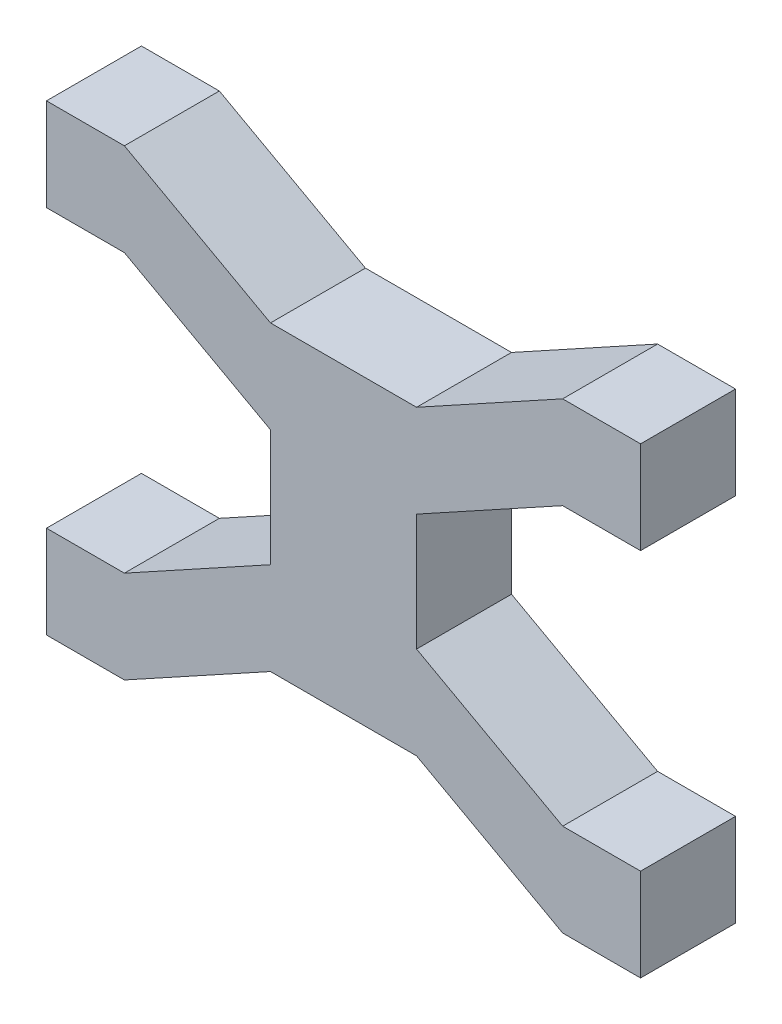
ISO-10303-21;
HEADER;
FILE_DESCRIPTION(('STEP AP214'),'2;1');
FILE_NAME('part.step','',(''),(''),'','','');
FILE_SCHEMA(('AUTOMOTIVE_DESIGN { 1 0 10303 214 1 1 1 1 }'));
ENDSEC;
DATA;
#1=APPLICATION_CONTEXT('core data for automotive mechanical design processes');
#2=APPLICATION_PROTOCOL_DEFINITION('international standard','automotive_design',2000,#1);
#3=PRODUCT_CONTEXT('',#1,'mechanical');
#4=PRODUCT('Part','Part','',(#3));
#5=PRODUCT_RELATED_PRODUCT_CATEGORY('part','',(#4));
#6=PRODUCT_DEFINITION_FORMATION('','',#4);
#7=PRODUCT_DEFINITION_CONTEXT('part definition',#1,'design');
#8=PRODUCT_DEFINITION('design','',#6,#7);
#9=PRODUCT_DEFINITION_SHAPE('','',#8);
#10=(LENGTH_UNIT() NAMED_UNIT(*) SI_UNIT(.MILLI.,.METRE.));
#11=(NAMED_UNIT(*) PLANE_ANGLE_UNIT() SI_UNIT($,.RADIAN.));
#12=(NAMED_UNIT(*) SI_UNIT($,.STERADIAN.) SOLID_ANGLE_UNIT());
#13=UNCERTAINTY_MEASURE_WITH_UNIT(LENGTH_MEASURE(1.E-05),#10,'distance_accuracy_value','');
#14=(GEOMETRIC_REPRESENTATION_CONTEXT(3) GLOBAL_UNCERTAINTY_ASSIGNED_CONTEXT((#13)) GLOBAL_UNIT_ASSIGNED_CONTEXT((#10,
#11,#12)) REPRESENTATION_CONTEXT('',''));
#15=CARTESIAN_POINT('',(0.,0.,0.));
#16=DIRECTION('',(0.,0.,1.));
#17=DIRECTION('',(1.,0.,0.));
#18=AXIS2_PLACEMENT_3D('',#15,#16,#17);
#19=CARTESIAN_POINT('',(-30.5,0.,9.75));
#20=DIRECTION('',(-1.,0.,0.));
#21=DIRECTION('',(0.,0.,1.));
#22=AXIS2_PLACEMENT_3D('',#19,#20,#21);
#23=PLANE('',#22);
#24=DIRECTION('',(0.,1.,0.));
#25=VECTOR('',#24,1.);
#26=CARTESIAN_POINT('',(-30.5,0.,0.));
#27=LINE('',#26,#25);
#28=CARTESIAN_POINT('',(-30.5,14.25,0.));
#29=VERTEX_POINT('',#28);
#30=CARTESIAN_POINT('',(-30.5,23.75,0.));
#31=VERTEX_POINT('',#30);
#32=EDGE_CURVE('E226',#29,#31,#27,.T.);
#33=ORIENTED_EDGE('',*,*,#32,.F.);
#34=DIRECTION('',(0.,0.,-1.));
#35=VECTOR('',#34,1.);
#36=CARTESIAN_POINT('',(-30.5,14.25,9.75));
#37=LINE('',#36,#35);
#38=CARTESIAN_POINT('',(-30.5,14.25,9.75));
#39=VERTEX_POINT('',#38);
#40=EDGE_CURVE('E11',#39,#29,#37,.T.);
#41=ORIENTED_EDGE('',*,*,#40,.F.);
#42=DIRECTION('',(0.,1.,0.));
#43=VECTOR('',#42,1.);
#44=CARTESIAN_POINT('',(-30.5,0.,9.75));
#45=LINE('',#44,#43);
#46=CARTESIAN_POINT('',(-30.5,23.75,9.75));
#47=VERTEX_POINT('',#46);
#48=EDGE_CURVE('E286',#39,#47,#45,.T.);
#49=ORIENTED_EDGE('',*,*,#48,.T.);
#50=DIRECTION('',(0.,0.,-1.));
#51=VECTOR('',#50,1.);
#52=CARTESIAN_POINT('',(-30.5,23.75,9.75));
#53=LINE('',#52,#51);
#54=EDGE_CURVE('E52',#47,#31,#53,.T.);
#55=ORIENTED_EDGE('',*,*,#54,.T.);
#56=EDGE_LOOP('',(#33,#41,#49,#55));
#57=FACE_BOUND('',#56,.T.);
#58=ADVANCED_FACE('F36',(#57),#23,.T.);
#59=CARTESIAN_POINT('',(0.,14.25,9.75));
#60=DIRECTION('',(0.,1.,0.));
#61=DIRECTION('',(-1.,0.,0.));
#62=AXIS2_PLACEMENT_3D('',#59,#60,#61);
#63=PLANE('',#62);
#64=DIRECTION('',(1.,0.,0.));
#65=VECTOR('',#64,1.);
#66=CARTESIAN_POINT('',(0.,14.25,0.));
#67=LINE('',#66,#65);
#68=CARTESIAN_POINT('',(-22.5,14.25,0.));
#69=VERTEX_POINT('',#68);
#70=EDGE_CURVE('E228',#29,#69,#67,.T.);
#71=ORIENTED_EDGE('',*,*,#70,.T.);
#72=DIRECTION('',(0.,0.,-1.));
#73=VECTOR('',#72,1.);
#74=CARTESIAN_POINT('',(-22.5,14.25,9.75));
#75=LINE('',#74,#73);
#76=CARTESIAN_POINT('',(-22.5,14.25,9.75));
#77=VERTEX_POINT('',#76);
#78=EDGE_CURVE('E44',#77,#69,#75,.T.);
#79=ORIENTED_EDGE('',*,*,#78,.F.);
#80=DIRECTION('',(1.,0.,0.));
#81=VECTOR('',#80,1.);
#82=CARTESIAN_POINT('',(0.,14.25,9.75));
#83=LINE('',#82,#81);
#84=EDGE_CURVE('E356',#39,#77,#83,.T.);
#85=ORIENTED_EDGE('',*,*,#84,.F.);
#86=ORIENTED_EDGE('',*,*,#40,.T.);
#87=EDGE_LOOP('',(#71,#79,#85,#86));
#88=FACE_BOUND('',#87,.T.);
#89=ADVANCED_FACE('F417',(#88),#63,.F.);
#90=CARTESIAN_POINT('',(0.791746641074856,1.43953934740883,9.75));
#91=DIRECTION('',(0.481918749772156,0.876215908676647,0.));
#92=DIRECTION('',(-0.876215908676647,0.481918749772156,0.));
#93=AXIS2_PLACEMENT_3D('',#90,#91,#92);
#94=PLANE('',#93);
#95=DIRECTION('',(0.876215908676647,-0.481918749772156,0.));
#96=VECTOR('',#95,1.);
#97=CARTESIAN_POINT('',(0.791746641074856,1.43953934740883,0.));
#98=LINE('',#97,#96);
#99=CARTESIAN_POINT('',(-7.5,6.,0.));
#100=VERTEX_POINT('',#99);
#101=EDGE_CURVE('E230',#69,#100,#98,.T.);
#102=ORIENTED_EDGE('',*,*,#101,.T.);
#103=DIRECTION('',(0.,0.,-1.));
#104=VECTOR('',#103,1.);
#105=CARTESIAN_POINT('',(-7.5,6.,9.75));
#106=LINE('',#105,#104);
#107=CARTESIAN_POINT('',(-7.5,6.,9.75));
#108=VERTEX_POINT('',#107);
#109=EDGE_CURVE('E330',#108,#100,#106,.T.);
#110=ORIENTED_EDGE('',*,*,#109,.F.);
#111=DIRECTION('',(0.876215908676647,-0.481918749772156,0.));
#112=VECTOR('',#111,1.);
#113=CARTESIAN_POINT('',(0.791746641074856,1.43953934740883,9.75));
#114=LINE('',#113,#112);
#115=EDGE_CURVE('E338',#77,#108,#114,.T.);
#116=ORIENTED_EDGE('',*,*,#115,.F.);
#117=ORIENTED_EDGE('',*,*,#78,.T.);
#118=EDGE_LOOP('',(#102,#110,#116,#117));
#119=FACE_BOUND('',#118,.T.);
#120=ADVANCED_FACE('F336',(#119),#94,.F.);
#121=CARTESIAN_POINT('',(-7.5,0.,9.75));
#122=DIRECTION('',(-1.,0.,0.));
#123=DIRECTION('',(0.,0.,1.));
#124=AXIS2_PLACEMENT_3D('',#121,#122,#123);
#125=PLANE('',#124);
#126=DIRECTION('',(0.,1.,0.));
#127=VECTOR('',#126,1.);
#128=CARTESIAN_POINT('',(-7.5,0.,0.));
#129=LINE('',#128,#127);
#130=CARTESIAN_POINT('',(-7.5,-6.,0.));
#131=VERTEX_POINT('',#130);
#132=EDGE_CURVE('E233',#131,#100,#129,.T.);
#133=ORIENTED_EDGE('',*,*,#132,.F.);
#134=DIRECTION('',(0.,0.,-1.));
#135=VECTOR('',#134,1.);
#136=CARTESIAN_POINT('',(-7.5,-6.,9.75));
#137=LINE('',#136,#135);
#138=CARTESIAN_POINT('',(-7.5,-6.,9.75));
#139=VERTEX_POINT('',#138);
#140=EDGE_CURVE('E328',#139,#131,#137,.T.);
#141=ORIENTED_EDGE('',*,*,#140,.F.);
#142=DIRECTION('',(0.,1.,0.));
#143=VECTOR('',#142,1.);
#144=CARTESIAN_POINT('',(-7.5,0.,9.75));
#145=LINE('',#144,#143);
#146=EDGE_CURVE('E349',#139,#108,#145,.T.);
#147=ORIENTED_EDGE('',*,*,#146,.T.);
#148=ORIENTED_EDGE('',*,*,#109,.T.);
#149=EDGE_LOOP('',(#133,#141,#147,#148));
#150=FACE_BOUND('',#149,.T.);
#151=ADVANCED_FACE('F346',(#150),#125,.T.);
#152=CARTESIAN_POINT('',(0.791746641074856,-1.43953934740883,9.75));
#153=DIRECTION('',(-0.481918749772156,0.876215908676647,0.));
#154=DIRECTION('',(-0.876215908676647,-0.481918749772156,0.));
#155=AXIS2_PLACEMENT_3D('',#152,#153,#154);
#156=PLANE('',#155);
#157=DIRECTION('',(0.876215908676647,0.481918749772156,0.));
#158=VECTOR('',#157,1.);
#159=CARTESIAN_POINT('',(0.791746641074856,-1.43953934740883,0.));
#160=LINE('',#159,#158);
#161=CARTESIAN_POINT('',(-22.5,-14.25,0.));
#162=VERTEX_POINT('',#161);
#163=EDGE_CURVE('E236',#162,#131,#160,.T.);
#164=ORIENTED_EDGE('',*,*,#163,.F.);
#165=DIRECTION('',(0.,0.,-1.));
#166=VECTOR('',#165,1.);
#167=CARTESIAN_POINT('',(-22.5,-14.25,9.75));
#168=LINE('',#167,#166);
#169=CARTESIAN_POINT('',(-22.5,-14.25,9.75));
#170=VERTEX_POINT('',#169);
#171=EDGE_CURVE('E326',#170,#162,#168,.T.);
#172=ORIENTED_EDGE('',*,*,#171,.F.);
#173=DIRECTION('',(0.876215908676647,0.481918749772156,0.));
#174=VECTOR('',#173,1.);
#175=CARTESIAN_POINT('',(0.791746641074856,-1.43953934740883,9.75));
#176=LINE('',#175,#174);
#177=EDGE_CURVE('E352',#170,#139,#176,.T.);
#178=ORIENTED_EDGE('',*,*,#177,.T.);
#179=ORIENTED_EDGE('',*,*,#140,.T.);
#180=EDGE_LOOP('',(#164,#172,#178,#179));
#181=FACE_BOUND('',#180,.T.);
#182=ADVANCED_FACE('F428',(#181),#156,.T.);
#183=CARTESIAN_POINT('',(0.,-14.25,9.75));
#184=DIRECTION('',(0.,1.,0.));
#185=DIRECTION('',(-1.,0.,0.));
#186=AXIS2_PLACEMENT_3D('',#183,#184,#185);
#187=PLANE('',#186);
#188=DIRECTION('',(1.,0.,0.));
#189=VECTOR('',#188,1.);
#190=CARTESIAN_POINT('',(0.,-14.25,0.));
#191=LINE('',#190,#189);
#192=CARTESIAN_POINT('',(-30.5,-14.25,0.));
#193=VERTEX_POINT('',#192);
#194=EDGE_CURVE('E239',#193,#162,#191,.T.);
#195=ORIENTED_EDGE('',*,*,#194,.F.);
#196=DIRECTION('',(0.,0.,-1.));
#197=VECTOR('',#196,1.);
#198=CARTESIAN_POINT('',(-30.5,-14.25,9.75));
#199=LINE('',#198,#197);
#200=CARTESIAN_POINT('',(-30.5,-14.25,9.75));
#201=VERTEX_POINT('',#200);
#202=EDGE_CURVE('E324',#201,#193,#199,.T.);
#203=ORIENTED_EDGE('',*,*,#202,.F.);
#204=DIRECTION('',(1.,0.,0.));
#205=VECTOR('',#204,1.);
#206=CARTESIAN_POINT('',(0.,-14.25,9.75));
#207=LINE('',#206,#205);
#208=EDGE_CURVE('E354',#201,#170,#207,.T.);
#209=ORIENTED_EDGE('',*,*,#208,.T.);
#210=ORIENTED_EDGE('',*,*,#171,.T.);
#211=EDGE_LOOP('',(#195,#203,#209,#210));
#212=FACE_BOUND('',#211,.T.);
#213=ADVANCED_FACE('F431',(#212),#187,.T.);
#214=CARTESIAN_POINT('',(-30.5,0.,9.75));
#215=DIRECTION('',(1.,0.,0.));
#216=DIRECTION('',(0.,0.,-1.));
#217=AXIS2_PLACEMENT_3D('',#214,#215,#216);
#218=PLANE('',#217);
#219=DIRECTION('',(0.,-1.,0.));
#220=VECTOR('',#219,1.);
#221=CARTESIAN_POINT('',(-30.5,0.,0.));
#222=LINE('',#221,#220);
#223=CARTESIAN_POINT('',(-30.5,-23.75,0.));
#224=VERTEX_POINT('',#223);
#225=EDGE_CURVE('E242',#193,#224,#222,.T.);
#226=ORIENTED_EDGE('',*,*,#225,.T.);
#227=DIRECTION('',(0.,0.,-1.));
#228=VECTOR('',#227,1.);
#229=CARTESIAN_POINT('',(-30.5,-23.75,9.75));
#230=LINE('',#229,#228);
#231=CARTESIAN_POINT('',(-30.5,-23.75,9.75));
#232=VERTEX_POINT('',#231);
#233=EDGE_CURVE('E321',#232,#224,#230,.T.);
#234=ORIENTED_EDGE('',*,*,#233,.F.);
#235=DIRECTION('',(0.,-1.,0.));
#236=VECTOR('',#235,1.);
#237=CARTESIAN_POINT('',(-30.5,0.,9.75));
#238=LINE('',#237,#236);
#239=EDGE_CURVE('E362',#201,#232,#238,.T.);
#240=ORIENTED_EDGE('',*,*,#239,.F.);
#241=ORIENTED_EDGE('',*,*,#202,.T.);
#242=EDGE_LOOP('',(#226,#234,#240,#241));
#243=FACE_BOUND('',#242,.T.);
#244=ADVANCED_FACE('F435',(#243),#218,.F.);
#245=CARTESIAN_POINT('',(0.,-23.75,9.75));
#246=DIRECTION('',(0.,1.,0.));
#247=DIRECTION('',(-1.,0.,0.));
#248=AXIS2_PLACEMENT_3D('',#245,#246,#247);
#249=PLANE('',#248);
#250=DIRECTION('',(1.,0.,0.));
#251=VECTOR('',#250,1.);
#252=CARTESIAN_POINT('',(0.,-23.75,0.));
#253=LINE('',#252,#251);
#254=CARTESIAN_POINT('',(-22.5,-23.75,0.));
#255=VERTEX_POINT('',#254);
#256=EDGE_CURVE('E244',#224,#255,#253,.T.);
#257=ORIENTED_EDGE('',*,*,#256,.T.);
#258=DIRECTION('',(0.,0.,-1.));
#259=VECTOR('',#258,1.);
#260=CARTESIAN_POINT('',(-22.5,-23.75,9.75));
#261=LINE('',#260,#259);
#262=CARTESIAN_POINT('',(-22.5,-23.75,9.75));
#263=VERTEX_POINT('',#262);
#264=EDGE_CURVE('E318',#263,#255,#261,.T.);
#265=ORIENTED_EDGE('',*,*,#264,.F.);
#266=DIRECTION('',(1.,0.,0.));
#267=VECTOR('',#266,1.);
#268=CARTESIAN_POINT('',(0.,-23.75,9.75));
#269=LINE('',#268,#267);
#270=EDGE_CURVE('E364',#232,#263,#269,.T.);
#271=ORIENTED_EDGE('',*,*,#270,.F.);
#272=ORIENTED_EDGE('',*,*,#233,.T.);
#273=EDGE_LOOP('',(#257,#265,#271,#272));
#274=FACE_BOUND('',#273,.T.);
#275=ADVANCED_FACE('F439',(#274),#249,.F.);
#276=CARTESIAN_POINT('',(4.80326295585412,-8.73320537428022,9.75));
#277=DIRECTION('',(-0.481918749772156,0.876215908676647,0.));
#278=DIRECTION('',(-0.876215908676647,-0.481918749772156,0.));
#279=AXIS2_PLACEMENT_3D('',#276,#277,#278);
#280=PLANE('',#279);
#281=DIRECTION('',(0.876215908676647,0.481918749772156,0.));
#282=VECTOR('',#281,1.);
#283=CARTESIAN_POINT('',(4.80326295585412,-8.73320537428022,0.));
#284=LINE('',#283,#282);
#285=CARTESIAN_POINT('',(-7.5,-15.5,0.));
#286=VERTEX_POINT('',#285);
#287=EDGE_CURVE('E246',#255,#286,#284,.T.);
#288=ORIENTED_EDGE('',*,*,#287,.T.);
#289=DIRECTION('',(0.,0.,-1.));
#290=VECTOR('',#289,1.);
#291=CARTESIAN_POINT('',(-7.5,-15.5,9.75));
#292=LINE('',#291,#290);
#293=CARTESIAN_POINT('',(-7.5,-15.5,9.75));
#294=VERTEX_POINT('',#293);
#295=EDGE_CURVE('E316',#294,#286,#292,.T.);
#296=ORIENTED_EDGE('',*,*,#295,.F.);
#297=DIRECTION('',(0.876215908676647,0.481918749772156,0.));
#298=VECTOR('',#297,1.);
#299=CARTESIAN_POINT('',(4.80326295585412,-8.73320537428022,9.75));
#300=LINE('',#299,#298);
#301=EDGE_CURVE('E366',#263,#294,#300,.T.);
#302=ORIENTED_EDGE('',*,*,#301,.F.);
#303=ORIENTED_EDGE('',*,*,#264,.T.);
#304=EDGE_LOOP('',(#288,#296,#302,#303));
#305=FACE_BOUND('',#304,.T.);
#306=ADVANCED_FACE('F443',(#305),#280,.F.);
#307=CARTESIAN_POINT('',(0.,-15.5,9.75));
#308=DIRECTION('',(0.,-1.,0.));
#309=DIRECTION('',(0.,0.,-1.));
#310=AXIS2_PLACEMENT_3D('',#307,#308,#309);
#311=PLANE('',#310);
#312=DIRECTION('',(-1.,0.,0.));
#313=VECTOR('',#312,1.);
#314=CARTESIAN_POINT('',(0.,-15.5,0.));
#315=LINE('',#314,#313);
#316=CARTESIAN_POINT('',(7.5,-15.5,0.));
#317=VERTEX_POINT('',#316);
#318=EDGE_CURVE('E249',#317,#286,#315,.T.);
#319=ORIENTED_EDGE('',*,*,#318,.F.);
#320=DIRECTION('',(0.,0.,-1.));
#321=VECTOR('',#320,1.);
#322=CARTESIAN_POINT('',(7.5,-15.5,9.75));
#323=LINE('',#322,#321);
#324=CARTESIAN_POINT('',(7.5,-15.5,9.75));
#325=VERTEX_POINT('',#324);
#326=EDGE_CURVE('E314',#325,#317,#323,.T.);
#327=ORIENTED_EDGE('',*,*,#326,.F.);
#328=DIRECTION('',(-1.,0.,0.));
#329=VECTOR('',#328,1.);
#330=CARTESIAN_POINT('',(0.,-15.5,9.75));
#331=LINE('',#330,#329);
#332=EDGE_CURVE('E368',#325,#294,#331,.T.);
#333=ORIENTED_EDGE('',*,*,#332,.T.);
#334=ORIENTED_EDGE('',*,*,#295,.T.);
#335=EDGE_LOOP('',(#319,#327,#333,#334));
#336=FACE_BOUND('',#335,.T.);
#337=ADVANCED_FACE('F447',(#336),#311,.T.);
#338=CARTESIAN_POINT('',(-4.80326295585412,-8.73320537428021,9.75));
#339=DIRECTION('',(-0.481918749772156,-0.876215908676647,0.));
#340=DIRECTION('',(0.876215908676647,-0.481918749772156,0.));
#341=AXIS2_PLACEMENT_3D('',#338,#339,#340);
#342=PLANE('',#341);
#343=DIRECTION('',(-0.876215908676647,0.481918749772156,0.));
#344=VECTOR('',#343,1.);
#345=CARTESIAN_POINT('',(-4.80326295585412,-8.73320537428021,0.));
#346=LINE('',#345,#344);
#347=CARTESIAN_POINT('',(22.5,-23.75,0.));
#348=VERTEX_POINT('',#347);
#349=EDGE_CURVE('E252',#348,#317,#346,.T.);
#350=ORIENTED_EDGE('',*,*,#349,.F.);
#351=DIRECTION('',(0.,0.,-1.));
#352=VECTOR('',#351,1.);
#353=CARTESIAN_POINT('',(22.5,-23.75,9.75));
#354=LINE('',#353,#352);
#355=CARTESIAN_POINT('',(22.5,-23.75,9.75));
#356=VERTEX_POINT('',#355);
#357=EDGE_CURVE('E312',#356,#348,#354,.T.);
#358=ORIENTED_EDGE('',*,*,#357,.F.);
#359=DIRECTION('',(-0.876215908676647,0.481918749772156,0.));
#360=VECTOR('',#359,1.);
#361=CARTESIAN_POINT('',(-4.80326295585412,-8.73320537428021,9.75));
#362=LINE('',#361,#360);
#363=EDGE_CURVE('E371',#356,#325,#362,.T.);
#364=ORIENTED_EDGE('',*,*,#363,.T.);
#365=ORIENTED_EDGE('',*,*,#326,.T.);
#366=EDGE_LOOP('',(#350,#358,#364,#365));
#367=FACE_BOUND('',#366,.T.);
#368=ADVANCED_FACE('F451',(#367),#342,.T.);
#369=CARTESIAN_POINT('',(0.,-23.75,9.75));
#370=DIRECTION('',(0.,-1.,0.));
#371=DIRECTION('',(1.,0.,0.));
#372=AXIS2_PLACEMENT_3D('',#369,#370,#371);
#373=PLANE('',#372);
#374=DIRECTION('',(-1.,0.,0.));
#375=VECTOR('',#374,1.);
#376=CARTESIAN_POINT('',(0.,-23.75,0.));
#377=LINE('',#376,#375);
#378=CARTESIAN_POINT('',(30.5,-23.75,0.));
#379=VERTEX_POINT('',#378);
#380=EDGE_CURVE('E255',#379,#348,#377,.T.);
#381=ORIENTED_EDGE('',*,*,#380,.F.);
#382=DIRECTION('',(0.,0.,-1.));
#383=VECTOR('',#382,1.);
#384=CARTESIAN_POINT('',(30.5,-23.75,9.75));
#385=LINE('',#384,#383);
#386=CARTESIAN_POINT('',(30.5,-23.75,9.75));
#387=VERTEX_POINT('',#386);
#388=EDGE_CURVE('E310',#387,#379,#385,.T.);
#389=ORIENTED_EDGE('',*,*,#388,.F.);
#390=DIRECTION('',(-1.,0.,0.));
#391=VECTOR('',#390,1.);
#392=CARTESIAN_POINT('',(0.,-23.75,9.75));
#393=LINE('',#392,#391);
#394=EDGE_CURVE('E374',#387,#356,#393,.T.);
#395=ORIENTED_EDGE('',*,*,#394,.T.);
#396=ORIENTED_EDGE('',*,*,#357,.T.);
#397=EDGE_LOOP('',(#381,#389,#395,#396));
#398=FACE_BOUND('',#397,.T.);
#399=ADVANCED_FACE('F455',(#398),#373,.T.);
#400=CARTESIAN_POINT('',(30.5,0.,9.75));
#401=DIRECTION('',(1.,0.,0.));
#402=DIRECTION('',(0.,1.,0.));
#403=AXIS2_PLACEMENT_3D('',#400,#401,#402);
#404=PLANE('',#403);
#405=DIRECTION('',(0.,-1.,0.));
#406=VECTOR('',#405,1.);
#407=CARTESIAN_POINT('',(30.5,0.,0.));
#408=LINE('',#407,#406);
#409=CARTESIAN_POINT('',(30.5,-14.25,0.));
#410=VERTEX_POINT('',#409);
#411=EDGE_CURVE('E258',#410,#379,#408,.T.);
#412=ORIENTED_EDGE('',*,*,#411,.F.);
#413=DIRECTION('',(0.,0.,-1.));
#414=VECTOR('',#413,1.);
#415=CARTESIAN_POINT('',(30.5,-14.25,9.75));
#416=LINE('',#415,#414);
#417=CARTESIAN_POINT('',(30.5,-14.25,9.75));
#418=VERTEX_POINT('',#417);
#419=EDGE_CURVE('E308',#418,#410,#416,.T.);
#420=ORIENTED_EDGE('',*,*,#419,.F.);
#421=DIRECTION('',(0.,-1.,0.));
#422=VECTOR('',#421,1.);
#423=CARTESIAN_POINT('',(30.5,0.,9.75));
#424=LINE('',#423,#422);
#425=EDGE_CURVE('E377',#418,#387,#424,.T.);
#426=ORIENTED_EDGE('',*,*,#425,.T.);
#427=ORIENTED_EDGE('',*,*,#388,.T.);
#428=EDGE_LOOP('',(#412,#420,#426,#427));
#429=FACE_BOUND('',#428,.T.);
#430=ADVANCED_FACE('F459',(#429),#404,.T.);
#431=CARTESIAN_POINT('',(0.,-14.25,9.75));
#432=DIRECTION('',(0.,-1.,0.));
#433=DIRECTION('',(1.,0.,0.));
#434=AXIS2_PLACEMENT_3D('',#431,#432,#433);
#435=PLANE('',#434);
#436=DIRECTION('',(-1.,0.,0.));
#437=VECTOR('',#436,1.);
#438=CARTESIAN_POINT('',(0.,-14.25,0.));
#439=LINE('',#438,#437);
#440=CARTESIAN_POINT('',(22.5,-14.25,0.));
#441=VERTEX_POINT('',#440);
#442=EDGE_CURVE('E261',#410,#441,#439,.T.);
#443=ORIENTED_EDGE('',*,*,#442,.T.);
#444=DIRECTION('',(0.,0.,-1.));
#445=VECTOR('',#444,1.);
#446=CARTESIAN_POINT('',(22.5,-14.25,9.75));
#447=LINE('',#446,#445);
#448=CARTESIAN_POINT('',(22.5,-14.25,9.75));
#449=VERTEX_POINT('',#448);
#450=EDGE_CURVE('E305',#449,#441,#447,.T.);
#451=ORIENTED_EDGE('',*,*,#450,.F.);
#452=DIRECTION('',(-1.,0.,0.));
#453=VECTOR('',#452,1.);
#454=CARTESIAN_POINT('',(0.,-14.25,9.75));
#455=LINE('',#454,#453);
#456=EDGE_CURVE('E380',#418,#449,#455,.T.);
#457=ORIENTED_EDGE('',*,*,#456,.F.);
#458=ORIENTED_EDGE('',*,*,#419,.T.);
#459=EDGE_LOOP('',(#443,#451,#457,#458));
#460=FACE_BOUND('',#459,.T.);
#461=ADVANCED_FACE('F463',(#460),#435,.F.);
#462=CARTESIAN_POINT('',(-0.791746641074856,-1.43953934740883,9.75));
#463=DIRECTION('',(-0.481918749772156,-0.876215908676647,0.));
#464=DIRECTION('',(0.876215908676647,-0.481918749772156,0.));
#465=AXIS2_PLACEMENT_3D('',#462,#463,#464);
#466=PLANE('',#465);
#467=DIRECTION('',(-0.876215908676647,0.481918749772156,0.));
#468=VECTOR('',#467,1.);
#469=CARTESIAN_POINT('',(-0.791746641074856,-1.43953934740883,0.));
#470=LINE('',#469,#468);
#471=CARTESIAN_POINT('',(7.5,-6.,0.));
#472=VERTEX_POINT('',#471);
#473=EDGE_CURVE('E263',#441,#472,#470,.T.);
#474=ORIENTED_EDGE('',*,*,#473,.T.);
#475=DIRECTION('',(0.,0.,-1.));
#476=VECTOR('',#475,1.);
#477=CARTESIAN_POINT('',(7.5,-6.,9.75));
#478=LINE('',#477,#476);
#479=CARTESIAN_POINT('',(7.5,-6.,9.75));
#480=VERTEX_POINT('',#479);
#481=EDGE_CURVE('E302',#480,#472,#478,.T.);
#482=ORIENTED_EDGE('',*,*,#481,.F.);
#483=DIRECTION('',(-0.876215908676647,0.481918749772156,0.));
#484=VECTOR('',#483,1.);
#485=CARTESIAN_POINT('',(-0.791746641074856,-1.43953934740883,9.75));
#486=LINE('',#485,#484);
#487=EDGE_CURVE('E382',#449,#480,#486,.T.);
#488=ORIENTED_EDGE('',*,*,#487,.F.);
#489=ORIENTED_EDGE('',*,*,#450,.T.);
#490=EDGE_LOOP('',(#474,#482,#488,#489));
#491=FACE_BOUND('',#490,.T.);
#492=ADVANCED_FACE('F467',(#491),#466,.F.);
#493=CARTESIAN_POINT('',(7.5,0.,9.75));
#494=DIRECTION('',(-1.,0.,0.));
#495=DIRECTION('',(0.,0.,1.));
#496=AXIS2_PLACEMENT_3D('',#493,#494,#495);
#497=PLANE('',#496);
#498=DIRECTION('',(0.,1.,0.));
#499=VECTOR('',#498,1.);
#500=CARTESIAN_POINT('',(7.5,0.,0.));
#501=LINE('',#500,#499);
#502=CARTESIAN_POINT('',(7.5,6.,0.));
#503=VERTEX_POINT('',#502);
#504=EDGE_CURVE('E265',#472,#503,#501,.T.);
#505=ORIENTED_EDGE('',*,*,#504,.T.);
#506=DIRECTION('',(0.,0.,-1.));
#507=VECTOR('',#506,1.);
#508=CARTESIAN_POINT('',(7.5,6.,9.75));
#509=LINE('',#508,#507);
#510=CARTESIAN_POINT('',(7.5,6.,9.75));
#511=VERTEX_POINT('',#510);
#512=EDGE_CURVE('E300',#511,#503,#509,.T.);
#513=ORIENTED_EDGE('',*,*,#512,.F.);
#514=DIRECTION('',(0.,1.,0.));
#515=VECTOR('',#514,1.);
#516=CARTESIAN_POINT('',(7.5,0.,9.75));
#517=LINE('',#516,#515);
#518=EDGE_CURVE('E384',#480,#511,#517,.T.);
#519=ORIENTED_EDGE('',*,*,#518,.F.);
#520=ORIENTED_EDGE('',*,*,#481,.T.);
#521=EDGE_LOOP('',(#505,#513,#519,#520));
#522=FACE_BOUND('',#521,.T.);
#523=ADVANCED_FACE('F471',(#522),#497,.F.);
#524=CARTESIAN_POINT('',(-0.791746641074856,1.43953934740883,9.75));
#525=DIRECTION('',(0.481918749772156,-0.876215908676647,0.));
#526=DIRECTION('',(0.876215908676647,0.481918749772156,0.));
#527=AXIS2_PLACEMENT_3D('',#524,#525,#526);
#528=PLANE('',#527);
#529=DIRECTION('',(-0.876215908676647,-0.481918749772156,0.));
#530=VECTOR('',#529,1.);
#531=CARTESIAN_POINT('',(-0.791746641074856,1.43953934740883,0.));
#532=LINE('',#531,#530);
#533=CARTESIAN_POINT('',(22.5,14.25,0.));
#534=VERTEX_POINT('',#533);
#535=EDGE_CURVE('E268',#534,#503,#532,.T.);
#536=ORIENTED_EDGE('',*,*,#535,.F.);
#537=DIRECTION('',(0.,0.,-1.));
#538=VECTOR('',#537,1.);
#539=CARTESIAN_POINT('',(22.5,14.25,9.75));
#540=LINE('',#539,#538);
#541=CARTESIAN_POINT('',(22.5,14.25,9.75));
#542=VERTEX_POINT('',#541);
#543=EDGE_CURVE('E298',#542,#534,#540,.T.);
#544=ORIENTED_EDGE('',*,*,#543,.F.);
#545=DIRECTION('',(-0.876215908676647,-0.481918749772156,0.));
#546=VECTOR('',#545,1.);
#547=CARTESIAN_POINT('',(-0.791746641074856,1.43953934740883,9.75));
#548=LINE('',#547,#546);
#549=EDGE_CURVE('E386',#542,#511,#548,.T.);
#550=ORIENTED_EDGE('',*,*,#549,.T.);
#551=ORIENTED_EDGE('',*,*,#512,.T.);
#552=EDGE_LOOP('',(#536,#544,#550,#551));
#553=FACE_BOUND('',#552,.T.);
#554=ADVANCED_FACE('F475',(#553),#528,.T.);
#555=CARTESIAN_POINT('',(0.,14.25,9.75));
#556=DIRECTION('',(0.,-1.,0.));
#557=DIRECTION('',(1.,0.,0.));
#558=AXIS2_PLACEMENT_3D('',#555,#556,#557);
#559=PLANE('',#558);
#560=DIRECTION('',(-1.,0.,0.));
#561=VECTOR('',#560,1.);
#562=CARTESIAN_POINT('',(0.,14.25,0.));
#563=LINE('',#562,#561);
#564=CARTESIAN_POINT('',(30.5,14.25,0.));
#565=VERTEX_POINT('',#564);
#566=EDGE_CURVE('E271',#565,#534,#563,.T.);
#567=ORIENTED_EDGE('',*,*,#566,.F.);
#568=DIRECTION('',(0.,0.,-1.));
#569=VECTOR('',#568,1.);
#570=CARTESIAN_POINT('',(30.5,14.25,9.75));
#571=LINE('',#570,#569);
#572=CARTESIAN_POINT('',(30.5,14.25,9.75));
#573=VERTEX_POINT('',#572);
#574=EDGE_CURVE('E296',#573,#565,#571,.T.);
#575=ORIENTED_EDGE('',*,*,#574,.F.);
#576=DIRECTION('',(-1.,0.,0.));
#577=VECTOR('',#576,1.);
#578=CARTESIAN_POINT('',(0.,14.25,9.75));
#579=LINE('',#578,#577);
#580=EDGE_CURVE('E389',#573,#542,#579,.T.);
#581=ORIENTED_EDGE('',*,*,#580,.T.);
#582=ORIENTED_EDGE('',*,*,#543,.T.);
#583=EDGE_LOOP('',(#567,#575,#581,#582));
#584=FACE_BOUND('',#583,.T.);
#585=ADVANCED_FACE('F479',(#584),#559,.T.);
#586=CARTESIAN_POINT('',(30.5,0.,9.75));
#587=DIRECTION('',(-1.,0.,0.));
#588=DIRECTION('',(0.,-1.,0.));
#589=AXIS2_PLACEMENT_3D('',#586,#587,#588);
#590=PLANE('',#589);
#591=DIRECTION('',(0.,1.,0.));
#592=VECTOR('',#591,1.);
#593=CARTESIAN_POINT('',(30.5,0.,0.));
#594=LINE('',#593,#592);
#595=CARTESIAN_POINT('',(30.5,23.75,0.));
#596=VERTEX_POINT('',#595);
#597=EDGE_CURVE('E274',#565,#596,#594,.T.);
#598=ORIENTED_EDGE('',*,*,#597,.T.);
#599=DIRECTION('',(0.,0.,-1.));
#600=VECTOR('',#599,1.);
#601=CARTESIAN_POINT('',(30.5,23.75,9.75));
#602=LINE('',#601,#600);
#603=CARTESIAN_POINT('',(30.5,23.75,9.75));
#604=VERTEX_POINT('',#603);
#605=EDGE_CURVE('E293',#604,#596,#602,.T.);
#606=ORIENTED_EDGE('',*,*,#605,.F.);
#607=DIRECTION('',(0.,1.,0.));
#608=VECTOR('',#607,1.);
#609=CARTESIAN_POINT('',(30.5,0.,9.75));
#610=LINE('',#609,#608);
#611=EDGE_CURVE('E392',#573,#604,#610,.T.);
#612=ORIENTED_EDGE('',*,*,#611,.F.);
#613=ORIENTED_EDGE('',*,*,#574,.T.);
#614=EDGE_LOOP('',(#598,#606,#612,#613));
#615=FACE_BOUND('',#614,.T.);
#616=ADVANCED_FACE('F483',(#615),#590,.F.);
#617=CARTESIAN_POINT('',(0.,23.75,9.75));
#618=DIRECTION('',(0.,-1.,0.));
#619=DIRECTION('',(1.,0.,0.));
#620=AXIS2_PLACEMENT_3D('',#617,#618,#619);
#621=PLANE('',#620);
#622=DIRECTION('',(-1.,0.,0.));
#623=VECTOR('',#622,1.);
#624=CARTESIAN_POINT('',(0.,23.75,0.));
#625=LINE('',#624,#623);
#626=CARTESIAN_POINT('',(22.5,23.75,0.));
#627=VERTEX_POINT('',#626);
#628=EDGE_CURVE('E276',#596,#627,#625,.T.);
#629=ORIENTED_EDGE('',*,*,#628,.T.);
#630=DIRECTION('',(0.,0.,-1.));
#631=VECTOR('',#630,1.);
#632=CARTESIAN_POINT('',(22.5,23.75,9.75));
#633=LINE('',#632,#631);
#634=CARTESIAN_POINT('',(22.5,23.75,9.75));
#635=VERTEX_POINT('',#634);
#636=EDGE_CURVE('E290',#635,#627,#633,.T.);
#637=ORIENTED_EDGE('',*,*,#636,.F.);
#638=DIRECTION('',(-1.,0.,0.));
#639=VECTOR('',#638,1.);
#640=CARTESIAN_POINT('',(0.,23.75,9.75));
#641=LINE('',#640,#639);
#642=EDGE_CURVE('E394',#604,#635,#641,.T.);
#643=ORIENTED_EDGE('',*,*,#642,.F.);
#644=ORIENTED_EDGE('',*,*,#605,.T.);
#645=EDGE_LOOP('',(#629,#637,#643,#644));
#646=FACE_BOUND('',#645,.T.);
#647=ADVANCED_FACE('F401',(#646),#621,.F.);
#648=CARTESIAN_POINT('',(-4.80326295585412,8.73320537428021,9.75));
#649=DIRECTION('',(0.481918749772156,-0.876215908676647,0.));
#650=DIRECTION('',(0.876215908676647,0.481918749772156,0.));
#651=AXIS2_PLACEMENT_3D('',#648,#649,#650);
#652=PLANE('',#651);
#653=DIRECTION('',(-0.876215908676647,-0.481918749772156,0.));
#654=VECTOR('',#653,1.);
#655=CARTESIAN_POINT('',(-4.80326295585412,8.73320537428021,0.));
#656=LINE('',#655,#654);
#657=CARTESIAN_POINT('',(7.5,15.5,0.));
#658=VERTEX_POINT('',#657);
#659=EDGE_CURVE('E278',#627,#658,#656,.T.);
#660=ORIENTED_EDGE('',*,*,#659,.T.);
#661=DIRECTION('',(0.,0.,-1.));
#662=VECTOR('',#661,1.);
#663=CARTESIAN_POINT('',(7.5,15.5,9.75));
#664=LINE('',#663,#662);
#665=CARTESIAN_POINT('',(7.5,15.5,9.75));
#666=VERTEX_POINT('',#665);
#667=EDGE_CURVE('E218',#666,#658,#664,.T.);
#668=ORIENTED_EDGE('',*,*,#667,.F.);
#669=DIRECTION('',(-0.876215908676647,-0.481918749772156,0.));
#670=VECTOR('',#669,1.);
#671=CARTESIAN_POINT('',(-4.80326295585412,8.73320537428021,9.75));
#672=LINE('',#671,#670);
#673=EDGE_CURVE('E206',#635,#666,#672,.T.);
#674=ORIENTED_EDGE('',*,*,#673,.F.);
#675=ORIENTED_EDGE('',*,*,#636,.T.);
#676=EDGE_LOOP('',(#660,#668,#674,#675));
#677=FACE_BOUND('',#676,.T.);
#678=ADVANCED_FACE('F405',(#677),#652,.F.);
#679=CARTESIAN_POINT('',(0.,15.5,9.75));
#680=DIRECTION('',(0.,-1.,0.));
#681=DIRECTION('',(0.,0.,-1.));
#682=AXIS2_PLACEMENT_3D('',#679,#680,#681);
#683=PLANE('',#682);
#684=DIRECTION('',(-1.,0.,0.));
#685=VECTOR('',#684,1.);
#686=CARTESIAN_POINT('',(0.,15.5,0.));
#687=LINE('',#686,#685);
#688=CARTESIAN_POINT('',(-7.5,15.5,0.));
#689=VERTEX_POINT('',#688);
#690=EDGE_CURVE('E215',#658,#689,#687,.T.);
#691=ORIENTED_EDGE('',*,*,#690,.T.);
#692=DIRECTION('',(0.,0.,-1.));
#693=VECTOR('',#692,1.);
#694=CARTESIAN_POINT('',(-7.5,15.5,9.75));
#695=LINE('',#694,#693);
#696=CARTESIAN_POINT('',(-7.5,15.5,9.75));
#697=VERTEX_POINT('',#696);
#698=EDGE_CURVE('E212',#697,#689,#695,.T.);
#699=ORIENTED_EDGE('',*,*,#698,.F.);
#700=DIRECTION('',(-1.,0.,0.));
#701=VECTOR('',#700,1.);
#702=CARTESIAN_POINT('',(0.,15.5,9.75));
#703=LINE('',#702,#701);
#704=EDGE_CURVE('E198',#666,#697,#703,.T.);
#705=ORIENTED_EDGE('',*,*,#704,.F.);
#706=ORIENTED_EDGE('',*,*,#667,.T.);
#707=EDGE_LOOP('',(#691,#699,#705,#706));
#708=FACE_BOUND('',#707,.T.);
#709=ADVANCED_FACE('F213',(#708),#683,.F.);
#710=CARTESIAN_POINT('',(4.80326295585412,8.73320537428022,9.75));
#711=DIRECTION('',(0.481918749772156,0.876215908676647,0.));
#712=DIRECTION('',(-0.876215908676647,0.481918749772156,0.));
#713=AXIS2_PLACEMENT_3D('',#710,#711,#712);
#714=PLANE('',#713);
#715=DIRECTION('',(0.876215908676647,-0.481918749772156,0.));
#716=VECTOR('',#715,1.);
#717=CARTESIAN_POINT('',(4.80326295585412,8.73320537428022,0.));
#718=LINE('',#717,#716);
#719=CARTESIAN_POINT('',(-22.5,23.75,0.));
#720=VERTEX_POINT('',#719);
#721=EDGE_CURVE('E281',#720,#689,#718,.T.);
#722=ORIENTED_EDGE('',*,*,#721,.F.);
#723=DIRECTION('',(0.,0.,-1.));
#724=VECTOR('',#723,1.);
#725=CARTESIAN_POINT('',(-22.5,23.75,9.75));
#726=LINE('',#725,#724);
#727=CARTESIAN_POINT('',(-22.5,23.75,9.75));
#728=VERTEX_POINT('',#727);
#729=EDGE_CURVE('E125',#728,#720,#726,.T.);
#730=ORIENTED_EDGE('',*,*,#729,.F.);
#731=DIRECTION('',(0.876215908676647,-0.481918749772156,0.));
#732=VECTOR('',#731,1.);
#733=CARTESIAN_POINT('',(4.80326295585412,8.73320537428022,9.75));
#734=LINE('',#733,#732);
#735=EDGE_CURVE('E204',#728,#697,#734,.T.);
#736=ORIENTED_EDGE('',*,*,#735,.T.);
#737=ORIENTED_EDGE('',*,*,#698,.T.);
#738=EDGE_LOOP('',(#722,#730,#736,#737));
#739=FACE_BOUND('',#738,.T.);
#740=ADVANCED_FACE('F220',(#739),#714,.T.);
#741=CARTESIAN_POINT('',(0.,23.75,9.75));
#742=DIRECTION('',(0.,1.,0.));
#743=DIRECTION('',(-1.,0.,0.));
#744=AXIS2_PLACEMENT_3D('',#741,#742,#743);
#745=PLANE('',#744);
#746=DIRECTION('',(1.,0.,0.));
#747=VECTOR('',#746,1.);
#748=CARTESIAN_POINT('',(0.,23.75,0.));
#749=LINE('',#748,#747);
#750=EDGE_CURVE('E283',#31,#720,#749,.T.);
#751=ORIENTED_EDGE('',*,*,#750,.F.);
#752=ORIENTED_EDGE('',*,*,#54,.F.);
#753=DIRECTION('',(1.,0.,0.));
#754=VECTOR('',#753,1.);
#755=CARTESIAN_POINT('',(0.,23.75,9.75));
#756=LINE('',#755,#754);
#757=EDGE_CURVE('E221',#47,#728,#756,.T.);
#758=ORIENTED_EDGE('',*,*,#757,.T.);
#759=ORIENTED_EDGE('',*,*,#729,.T.);
#760=EDGE_LOOP('',(#751,#752,#758,#759));
#761=FACE_BOUND('',#760,.T.);
#762=ADVANCED_FACE('F406',(#761),#745,.T.);
#763=CARTESIAN_POINT('',(0.,0.,9.75));
#764=DIRECTION('',(0.,0.,1.));
#765=DIRECTION('',(1.,0.,0.));
#766=AXIS2_PLACEMENT_3D('',#763,#764,#765);
#767=PLANE('',#766);
#768=ORIENTED_EDGE('',*,*,#48,.F.);
#769=ORIENTED_EDGE('',*,*,#84,.T.);
#770=ORIENTED_EDGE('',*,*,#115,.T.);
#771=ORIENTED_EDGE('',*,*,#146,.F.);
#772=ORIENTED_EDGE('',*,*,#177,.F.);
#773=ORIENTED_EDGE('',*,*,#208,.F.);
#774=ORIENTED_EDGE('',*,*,#239,.T.);
#775=ORIENTED_EDGE('',*,*,#270,.T.);
#776=ORIENTED_EDGE('',*,*,#301,.T.);
#777=ORIENTED_EDGE('',*,*,#332,.F.);
#778=ORIENTED_EDGE('',*,*,#363,.F.);
#779=ORIENTED_EDGE('',*,*,#394,.F.);
#780=ORIENTED_EDGE('',*,*,#425,.F.);
#781=ORIENTED_EDGE('',*,*,#456,.T.);
#782=ORIENTED_EDGE('',*,*,#487,.T.);
#783=ORIENTED_EDGE('',*,*,#518,.T.);
#784=ORIENTED_EDGE('',*,*,#549,.F.);
#785=ORIENTED_EDGE('',*,*,#580,.F.);
#786=ORIENTED_EDGE('',*,*,#611,.T.);
#787=ORIENTED_EDGE('',*,*,#642,.T.);
#788=ORIENTED_EDGE('',*,*,#673,.T.);
#789=ORIENTED_EDGE('',*,*,#704,.T.);
#790=ORIENTED_EDGE('',*,*,#735,.F.);
#791=ORIENTED_EDGE('',*,*,#757,.F.);
#792=EDGE_LOOP('',(#768,#769,#770,#771,#772,#773,#774,#775,#776,#777,#778,#779,#780,#781,#782,
#783,#784,#785,#786,#787,#788,#789,#790,#791));
#793=FACE_BOUND('',#792,.T.);
#794=ADVANCED_FACE('F201',(#793),#767,.T.);
#795=CARTESIAN_POINT('',(0.,0.,0.));
#796=DIRECTION('',(0.,0.,1.));
#797=DIRECTION('',(1.,0.,0.));
#798=AXIS2_PLACEMENT_3D('',#795,#796,#797);
#799=PLANE('',#798);
#800=ORIENTED_EDGE('',*,*,#32,.T.);
#801=ORIENTED_EDGE('',*,*,#750,.T.);
#802=ORIENTED_EDGE('',*,*,#721,.T.);
#803=ORIENTED_EDGE('',*,*,#690,.F.);
#804=ORIENTED_EDGE('',*,*,#659,.F.);
#805=ORIENTED_EDGE('',*,*,#628,.F.);
#806=ORIENTED_EDGE('',*,*,#597,.F.);
#807=ORIENTED_EDGE('',*,*,#566,.T.);
#808=ORIENTED_EDGE('',*,*,#535,.T.);
#809=ORIENTED_EDGE('',*,*,#504,.F.);
#810=ORIENTED_EDGE('',*,*,#473,.F.);
#811=ORIENTED_EDGE('',*,*,#442,.F.);
#812=ORIENTED_EDGE('',*,*,#411,.T.);
#813=ORIENTED_EDGE('',*,*,#380,.T.);
#814=ORIENTED_EDGE('',*,*,#349,.T.);
#815=ORIENTED_EDGE('',*,*,#318,.T.);
#816=ORIENTED_EDGE('',*,*,#287,.F.);
#817=ORIENTED_EDGE('',*,*,#256,.F.);
#818=ORIENTED_EDGE('',*,*,#225,.F.);
#819=ORIENTED_EDGE('',*,*,#194,.T.);
#820=ORIENTED_EDGE('',*,*,#163,.T.);
#821=ORIENTED_EDGE('',*,*,#132,.T.);
#822=ORIENTED_EDGE('',*,*,#101,.F.);
#823=ORIENTED_EDGE('',*,*,#70,.F.);
#824=EDGE_LOOP('',(#800,#801,#802,#803,#804,#805,#806,#807,#808,#809,#810,#811,#812,#813,#814,
#815,#816,#817,#818,#819,#820,#821,#822,#823));
#825=FACE_BOUND('',#824,.T.);
#826=ADVANCED_FACE('F342',(#825),#799,.F.);
#827=CLOSED_SHELL('',(#58,#89,#120,#151,#182,#213,#244,#275,#306,#337,#368,#399,#430,#461,#492,
#523,#554,#585,#616,#647,#678,#709,#740,#762,#794,#826));
#828=MANIFOLD_SOLID_BREP('B2',#827);
#829=ADVANCED_BREP_SHAPE_REPRESENTATION('',(#18,#828),#14);
#830=SHAPE_DEFINITION_REPRESENTATION(#9,#829);
ENDSEC;
END-ISO-10303-21;
